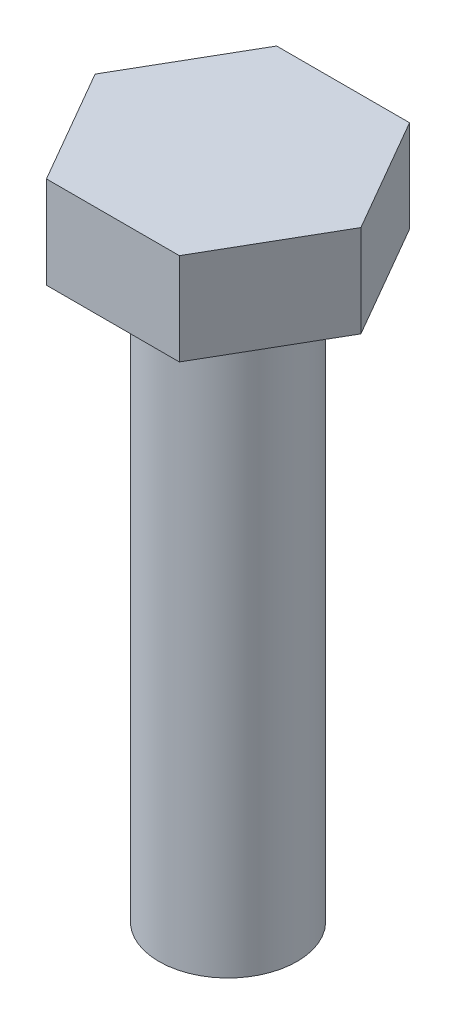
ISO-10303-21;
HEADER;
FILE_DESCRIPTION(('STEP AP214'),'2;1');
FILE_NAME('part.step','',(''),(''),'','','');
FILE_SCHEMA(('AUTOMOTIVE_DESIGN { 1 0 10303 214 1 1 1 1 }'));
ENDSEC;
DATA;
#1=APPLICATION_CONTEXT('core data for automotive mechanical design processes');
#2=APPLICATION_PROTOCOL_DEFINITION('international standard','automotive_design',2000,#1);
#3=PRODUCT_CONTEXT('',#1,'mechanical');
#4=PRODUCT('Part','Part','',(#3));
#5=PRODUCT_RELATED_PRODUCT_CATEGORY('part','',(#4));
#6=PRODUCT_DEFINITION_FORMATION('','',#4);
#7=PRODUCT_DEFINITION_CONTEXT('part definition',#1,'design');
#8=PRODUCT_DEFINITION('design','',#6,#7);
#9=PRODUCT_DEFINITION_SHAPE('','',#8);
#10=(LENGTH_UNIT() NAMED_UNIT(*) SI_UNIT(.MILLI.,.METRE.));
#11=(NAMED_UNIT(*) PLANE_ANGLE_UNIT() SI_UNIT($,.RADIAN.));
#12=(NAMED_UNIT(*) SI_UNIT($,.STERADIAN.) SOLID_ANGLE_UNIT());
#13=UNCERTAINTY_MEASURE_WITH_UNIT(LENGTH_MEASURE(1.E-05),#10,'distance_accuracy_value','');
#14=(GEOMETRIC_REPRESENTATION_CONTEXT(3) GLOBAL_UNCERTAINTY_ASSIGNED_CONTEXT((#13)) GLOBAL_UNIT_ASSIGNED_CONTEXT((#10,
#11,#12)) REPRESENTATION_CONTEXT('',''));
#15=CARTESIAN_POINT('',(0.,0.,0.));
#16=DIRECTION('',(0.,0.,1.));
#17=DIRECTION('',(1.,0.,0.));
#18=AXIS2_PLACEMENT_3D('',#15,#16,#17);
#19=CARTESIAN_POINT('',(0.,25.,0.));
#20=DIRECTION('',(0.,-1.,0.));
#21=DIRECTION('',(0.,0.,-1.));
#22=AXIS2_PLACEMENT_3D('',#19,#20,#21);
#23=CYLINDRICAL_SURFACE('',#22,3.);
#24=CARTESIAN_POINT('',(0.,25.,0.));
#25=DIRECTION('',(0.,1.,0.));
#26=DIRECTION('',(0.,0.,1.));
#27=AXIS2_PLACEMENT_3D('',#24,#25,#26);
#28=CIRCLE('',#27,3.);
#29=CARTESIAN_POINT('',(0.,25.,3.));
#30=VERTEX_POINT('',#29);
#31=EDGE_CURVE('E11',#30,#30,#28,.T.);
#32=ORIENTED_EDGE('',*,*,#31,.F.);
#33=EDGE_LOOP('',(#32));
#34=FACE_BOUND('',#33,.T.);
#35=CARTESIAN_POINT('',(0.,0.,0.));
#36=DIRECTION('',(0.,1.,0.));
#37=DIRECTION('',(0.,0.,1.));
#38=AXIS2_PLACEMENT_3D('',#35,#36,#37);
#39=CIRCLE('',#38,3.);
#40=CARTESIAN_POINT('',(0.,0.,3.));
#41=VERTEX_POINT('',#40);
#42=EDGE_CURVE('E44',#41,#41,#39,.T.);
#43=ORIENTED_EDGE('',*,*,#42,.T.);
#44=EDGE_LOOP('',(#43));
#45=FACE_BOUND('',#44,.T.);
#46=ADVANCED_FACE('F41',(#34,#45),#23,.T.);
#47=CARTESIAN_POINT('',(0.,0.,0.));
#48=DIRECTION('',(0.,1.,0.));
#49=DIRECTION('',(0.,0.,1.));
#50=AXIS2_PLACEMENT_3D('',#47,#48,#49);
#51=PLANE('',#50);
#52=ORIENTED_EDGE('',*,*,#42,.F.);
#53=EDGE_LOOP('',(#52));
#54=FACE_BOUND('',#53,.T.);
#55=ADVANCED_FACE('F149',(#54),#51,.F.);
#56=CARTESIAN_POINT('',(2.88675134594813,29.,-5.));
#57=DIRECTION('',(-0.866025403784439,0.,0.5));
#58=DIRECTION('',(0.5,0.,0.866025403784439));
#59=AXIS2_PLACEMENT_3D('',#56,#57,#58);
#60=PLANE('',#59);
#61=DIRECTION('',(-0.5,0.,-0.866025403784439));
#62=VECTOR('',#61,1.);
#63=CARTESIAN_POINT('',(2.88675134594813,25.,-5.));
#64=LINE('',#63,#62);
#65=CARTESIAN_POINT('',(5.77350269189626,25.,0.));
#66=VERTEX_POINT('',#65);
#67=CARTESIAN_POINT('',(2.88675134594813,25.,-5.));
#68=VERTEX_POINT('',#67);
#69=EDGE_CURVE('E126',#66,#68,#64,.T.);
#70=ORIENTED_EDGE('',*,*,#69,.T.);
#71=DIRECTION('',(0.,-1.,0.));
#72=VECTOR('',#71,1.);
#73=CARTESIAN_POINT('',(2.88675134594813,29.,-5.));
#74=LINE('',#73,#72);
#75=CARTESIAN_POINT('',(2.88675134594813,29.,-5.));
#76=VERTEX_POINT('',#75);
#77=EDGE_CURVE('E143',#76,#68,#74,.T.);
#78=ORIENTED_EDGE('',*,*,#77,.F.);
#79=DIRECTION('',(-0.5,0.,-0.866025403784439));
#80=VECTOR('',#79,1.);
#81=CARTESIAN_POINT('',(2.88675134594813,29.,-5.));
#82=LINE('',#81,#80);
#83=CARTESIAN_POINT('',(5.77350269189626,29.,0.));
#84=VERTEX_POINT('',#83);
#85=EDGE_CURVE('E136',#84,#76,#82,.T.);
#86=ORIENTED_EDGE('',*,*,#85,.F.);
#87=DIRECTION('',(0.,-1.,0.));
#88=VECTOR('',#87,1.);
#89=CARTESIAN_POINT('',(5.77350269189626,29.,0.));
#90=LINE('',#89,#88);
#91=EDGE_CURVE('E122',#84,#66,#90,.T.);
#92=ORIENTED_EDGE('',*,*,#91,.T.);
#93=EDGE_LOOP('',(#70,#78,#86,#92));
#94=FACE_BOUND('',#93,.T.);
#95=ADVANCED_FACE('F151',(#94),#60,.F.);
#96=CARTESIAN_POINT('',(-2.88675134594813,29.,-5.));
#97=DIRECTION('',(0.,0.,1.));
#98=DIRECTION('',(1.,0.,0.));
#99=AXIS2_PLACEMENT_3D('',#96,#97,#98);
#100=PLANE('',#99);
#101=DIRECTION('',(-1.,0.,0.));
#102=VECTOR('',#101,1.);
#103=CARTESIAN_POINT('',(-2.88675134594813,25.,-5.));
#104=LINE('',#103,#102);
#105=CARTESIAN_POINT('',(-2.88675134594813,25.,-5.));
#106=VERTEX_POINT('',#105);
#107=EDGE_CURVE('E129',#68,#106,#104,.T.);
#108=ORIENTED_EDGE('',*,*,#107,.T.);
#109=DIRECTION('',(0.,-1.,0.));
#110=VECTOR('',#109,1.);
#111=CARTESIAN_POINT('',(-2.88675134594813,29.,-5.));
#112=LINE('',#111,#110);
#113=CARTESIAN_POINT('',(-2.88675134594813,29.,-5.));
#114=VERTEX_POINT('',#113);
#115=EDGE_CURVE('E140',#114,#106,#112,.T.);
#116=ORIENTED_EDGE('',*,*,#115,.F.);
#117=DIRECTION('',(-1.,0.,0.));
#118=VECTOR('',#117,1.);
#119=CARTESIAN_POINT('',(-2.88675134594813,29.,-5.));
#120=LINE('',#119,#118);
#121=EDGE_CURVE('E95',#76,#114,#120,.T.);
#122=ORIENTED_EDGE('',*,*,#121,.F.);
#123=ORIENTED_EDGE('',*,*,#77,.T.);
#124=EDGE_LOOP('',(#108,#116,#122,#123));
#125=FACE_BOUND('',#124,.T.);
#126=ADVANCED_FACE('F156',(#125),#100,.F.);
#127=CARTESIAN_POINT('',(-5.77350269189626,29.,0.));
#128=DIRECTION('',(0.866025403784439,0.,0.5));
#129=DIRECTION('',(0.5,0.,-0.866025403784439));
#130=AXIS2_PLACEMENT_3D('',#127,#128,#129);
#131=PLANE('',#130);
#132=DIRECTION('',(-0.5,0.,0.866025403784439));
#133=VECTOR('',#132,1.);
#134=CARTESIAN_POINT('',(-5.77350269189626,25.,0.));
#135=LINE('',#134,#133);
#136=CARTESIAN_POINT('',(-5.77350269189626,25.,0.));
#137=VERTEX_POINT('',#136);
#138=EDGE_CURVE('E131',#106,#137,#135,.T.);
#139=ORIENTED_EDGE('',*,*,#138,.T.);
#140=DIRECTION('',(0.,-1.,0.));
#141=VECTOR('',#140,1.);
#142=CARTESIAN_POINT('',(-5.77350269189626,29.,0.));
#143=LINE('',#142,#141);
#144=CARTESIAN_POINT('',(-5.77350269189626,29.,0.));
#145=VERTEX_POINT('',#144);
#146=EDGE_CURVE('E117',#145,#137,#143,.T.);
#147=ORIENTED_EDGE('',*,*,#146,.F.);
#148=DIRECTION('',(-0.5,0.,0.866025403784439));
#149=VECTOR('',#148,1.);
#150=CARTESIAN_POINT('',(-5.77350269189626,29.,0.));
#151=LINE('',#150,#149);
#152=EDGE_CURVE('E108',#114,#145,#151,.T.);
#153=ORIENTED_EDGE('',*,*,#152,.F.);
#154=ORIENTED_EDGE('',*,*,#115,.T.);
#155=EDGE_LOOP('',(#139,#147,#153,#154));
#156=FACE_BOUND('',#155,.T.);
#157=ADVANCED_FACE('F163',(#156),#131,.F.);
#158=CARTESIAN_POINT('',(-2.88675134594813,29.,5.));
#159=DIRECTION('',(0.866025403784439,0.,-0.5));
#160=DIRECTION('',(-0.5,0.,-0.866025403784439));
#161=AXIS2_PLACEMENT_3D('',#158,#159,#160);
#162=PLANE('',#161);
#163=DIRECTION('',(0.5,0.,0.866025403784439));
#164=VECTOR('',#163,1.);
#165=CARTESIAN_POINT('',(-2.88675134594813,25.,5.));
#166=LINE('',#165,#164);
#167=CARTESIAN_POINT('',(-2.88675134594813,25.,5.));
#168=VERTEX_POINT('',#167);
#169=EDGE_CURVE('E116',#137,#168,#166,.T.);
#170=ORIENTED_EDGE('',*,*,#169,.T.);
#171=DIRECTION('',(0.,-1.,0.));
#172=VECTOR('',#171,1.);
#173=CARTESIAN_POINT('',(-2.88675134594813,29.,5.));
#174=LINE('',#173,#172);
#175=CARTESIAN_POINT('',(-2.88675134594813,29.,5.));
#176=VERTEX_POINT('',#175);
#177=EDGE_CURVE('E113',#176,#168,#174,.T.);
#178=ORIENTED_EDGE('',*,*,#177,.F.);
#179=DIRECTION('',(0.5,0.,0.866025403784439));
#180=VECTOR('',#179,1.);
#181=CARTESIAN_POINT('',(-2.88675134594813,29.,5.));
#182=LINE('',#181,#180);
#183=EDGE_CURVE('E102',#145,#176,#182,.T.);
#184=ORIENTED_EDGE('',*,*,#183,.F.);
#185=ORIENTED_EDGE('',*,*,#146,.T.);
#186=EDGE_LOOP('',(#170,#178,#184,#185));
#187=FACE_BOUND('',#186,.T.);
#188=ADVANCED_FACE('F114',(#187),#162,.F.);
#189=CARTESIAN_POINT('',(2.88675134594813,29.,5.));
#190=DIRECTION('',(0.,0.,-1.));
#191=DIRECTION('',(-1.,0.,0.));
#192=AXIS2_PLACEMENT_3D('',#189,#190,#191);
#193=PLANE('',#192);
#194=DIRECTION('',(1.,0.,0.));
#195=VECTOR('',#194,1.);
#196=CARTESIAN_POINT('',(2.88675134594813,25.,5.));
#197=LINE('',#196,#195);
#198=CARTESIAN_POINT('',(2.88675134594813,25.,5.));
#199=VERTEX_POINT('',#198);
#200=EDGE_CURVE('E80',#168,#199,#197,.T.);
#201=ORIENTED_EDGE('',*,*,#200,.T.);
#202=DIRECTION('',(0.,-1.,0.));
#203=VECTOR('',#202,1.);
#204=CARTESIAN_POINT('',(2.88675134594813,29.,5.));
#205=LINE('',#204,#203);
#206=CARTESIAN_POINT('',(2.88675134594813,29.,5.));
#207=VERTEX_POINT('',#206);
#208=EDGE_CURVE('E118',#207,#199,#205,.T.);
#209=ORIENTED_EDGE('',*,*,#208,.F.);
#210=DIRECTION('',(1.,0.,0.));
#211=VECTOR('',#210,1.);
#212=CARTESIAN_POINT('',(2.88675134594813,29.,5.));
#213=LINE('',#212,#211);
#214=EDGE_CURVE('E106',#176,#207,#213,.T.);
#215=ORIENTED_EDGE('',*,*,#214,.F.);
#216=ORIENTED_EDGE('',*,*,#177,.T.);
#217=EDGE_LOOP('',(#201,#209,#215,#216));
#218=FACE_BOUND('',#217,.T.);
#219=ADVANCED_FACE('F120',(#218),#193,.F.);
#220=CARTESIAN_POINT('',(5.77350269189626,29.,0.));
#221=DIRECTION('',(-0.866025403784439,0.,-0.5));
#222=DIRECTION('',(-0.5,0.,0.866025403784439));
#223=AXIS2_PLACEMENT_3D('',#220,#221,#222);
#224=PLANE('',#223);
#225=DIRECTION('',(0.5,0.,-0.866025403784439));
#226=VECTOR('',#225,1.);
#227=CARTESIAN_POINT('',(5.77350269189626,25.,0.));
#228=LINE('',#227,#226);
#229=EDGE_CURVE('E86',#199,#66,#228,.T.);
#230=ORIENTED_EDGE('',*,*,#229,.T.);
#231=ORIENTED_EDGE('',*,*,#91,.F.);
#232=DIRECTION('',(0.5,0.,-0.866025403784439));
#233=VECTOR('',#232,1.);
#234=CARTESIAN_POINT('',(5.77350269189626,29.,0.));
#235=LINE('',#234,#233);
#236=EDGE_CURVE('E57',#207,#84,#235,.T.);
#237=ORIENTED_EDGE('',*,*,#236,.F.);
#238=ORIENTED_EDGE('',*,*,#208,.T.);
#239=EDGE_LOOP('',(#230,#231,#237,#238));
#240=FACE_BOUND('',#239,.T.);
#241=ADVANCED_FACE('F171',(#240),#224,.F.);
#242=CARTESIAN_POINT('',(0.,29.,0.));
#243=DIRECTION('',(0.,-1.,0.));
#244=DIRECTION('',(0.,0.,-1.));
#245=AXIS2_PLACEMENT_3D('',#242,#243,#244);
#246=PLANE('',#245);
#247=ORIENTED_EDGE('',*,*,#85,.T.);
#248=ORIENTED_EDGE('',*,*,#121,.T.);
#249=ORIENTED_EDGE('',*,*,#152,.T.);
#250=ORIENTED_EDGE('',*,*,#183,.T.);
#251=ORIENTED_EDGE('',*,*,#214,.T.);
#252=ORIENTED_EDGE('',*,*,#236,.T.);
#253=EDGE_LOOP('',(#247,#248,#249,#250,#251,#252));
#254=FACE_BOUND('',#253,.T.);
#255=ADVANCED_FACE('F104',(#254),#246,.F.);
#256=CARTESIAN_POINT('',(0.,25.,0.));
#257=DIRECTION('',(0.,-1.,0.));
#258=DIRECTION('',(0.,0.,-1.));
#259=AXIS2_PLACEMENT_3D('',#256,#257,#258);
#260=PLANE('',#259);
#261=ORIENTED_EDGE('',*,*,#31,.T.);
#262=EDGE_LOOP('',(#261));
#263=FACE_BOUND('',#262,.T.);
#264=ORIENTED_EDGE('',*,*,#69,.F.);
#265=ORIENTED_EDGE('',*,*,#229,.F.);
#266=ORIENTED_EDGE('',*,*,#200,.F.);
#267=ORIENTED_EDGE('',*,*,#169,.F.);
#268=ORIENTED_EDGE('',*,*,#138,.F.);
#269=ORIENTED_EDGE('',*,*,#107,.F.);
#270=EDGE_LOOP('',(#264,#265,#266,#267,#268,#269));
#271=FACE_BOUND('',#270,.T.);
#272=ADVANCED_FACE('F174',(#263,#271),#260,.T.);
#273=CLOSED_SHELL('',(#46,#55,#95,#126,#157,#188,#219,#241,#255,#272));
#274=MANIFOLD_SOLID_BREP('B2',#273);
#275=ADVANCED_BREP_SHAPE_REPRESENTATION('',(#18,#274),#14);
#276=SHAPE_DEFINITION_REPRESENTATION(#9,#275);
ENDSEC;
END-ISO-10303-21;
